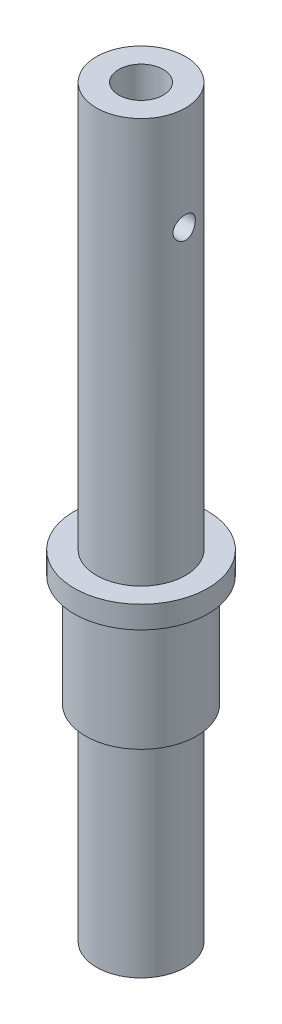
ISO-10303-21;
HEADER;
FILE_DESCRIPTION(('STEP AP214'),'2;1');
FILE_NAME('part.step','',(''),(''),'','','');
FILE_SCHEMA(('AUTOMOTIVE_DESIGN { 1 0 10303 214 1 1 1 1 }'));
ENDSEC;
DATA;
#1=APPLICATION_CONTEXT('core data for automotive mechanical design processes');
#2=APPLICATION_PROTOCOL_DEFINITION('international standard','automotive_design',2000,#1);
#3=PRODUCT_CONTEXT('',#1,'mechanical');
#4=PRODUCT('Part','Part','',(#3));
#5=PRODUCT_RELATED_PRODUCT_CATEGORY('part','',(#4));
#6=PRODUCT_DEFINITION_FORMATION('','',#4);
#7=PRODUCT_DEFINITION_CONTEXT('part definition',#1,'design');
#8=PRODUCT_DEFINITION('design','',#6,#7);
#9=PRODUCT_DEFINITION_SHAPE('','',#8);
#10=(LENGTH_UNIT() NAMED_UNIT(*) SI_UNIT(.MILLI.,.METRE.));
#11=(NAMED_UNIT(*) PLANE_ANGLE_UNIT() SI_UNIT($,.RADIAN.));
#12=(NAMED_UNIT(*) SI_UNIT($,.STERADIAN.) SOLID_ANGLE_UNIT());
#13=UNCERTAINTY_MEASURE_WITH_UNIT(LENGTH_MEASURE(1.E-05),#10,'distance_accuracy_value','');
#14=(GEOMETRIC_REPRESENTATION_CONTEXT(3) GLOBAL_UNCERTAINTY_ASSIGNED_CONTEXT((#13)) GLOBAL_UNIT_ASSIGNED_CONTEXT((#10,
#11,#12)) REPRESENTATION_CONTEXT('',''));
#15=CARTESIAN_POINT('',(0.,0.,0.));
#16=DIRECTION('',(0.,0.,1.));
#17=DIRECTION('',(1.,0.,0.));
#18=AXIS2_PLACEMENT_3D('',#15,#16,#17);
#19=CARTESIAN_POINT('',(0.,10.2921875,0.));
#20=DIRECTION('',(0.,-1.,0.));
#21=DIRECTION('',(0.,0.,-1.));
#22=AXIS2_PLACEMENT_3D('',#19,#20,#21);
#23=CYLINDRICAL_SURFACE('',#22,4.);
#24=CARTESIAN_POINT('',(0.,10.2921875,0.));
#25=DIRECTION('',(0.,1.,0.));
#26=DIRECTION('',(0.,0.,1.));
#27=AXIS2_PLACEMENT_3D('',#24,#25,#26);
#28=CIRCLE('',#27,4.);
#29=CARTESIAN_POINT('',(0.,10.2921875,4.));
#30=VERTEX_POINT('',#29);
#31=EDGE_CURVE('E10',#30,#30,#28,.T.);
#32=ORIENTED_EDGE('',*,*,#31,.F.);
#33=EDGE_LOOP('',(#32));
#34=FACE_BOUND('',#33,.T.);
#35=CARTESIAN_POINT('',(0.,-26.0921875,0.));
#36=DIRECTION('',(0.,-1.,0.));
#37=DIRECTION('',(0.,0.,-1.));
#38=AXIS2_PLACEMENT_3D('',#35,#36,#37);
#39=CIRCLE('',#38,4.);
#40=CARTESIAN_POINT('',(0.,-26.0921875,-4.));
#41=VERTEX_POINT('',#40);
#42=EDGE_CURVE('E81',#41,#41,#39,.T.);
#43=ORIENTED_EDGE('',*,*,#42,.F.);
#44=EDGE_LOOP('',(#43));
#45=FACE_BOUND('',#44,.T.);
#46=CARTESIAN_POINT('',(-3.87298334620742,1.,1.));
#47=CARTESIAN_POINT('',(-3.87298440057185,1.05522030035679,0.999998431438699));
#48=CARTESIAN_POINT('',(-3.87417722499278,1.11045795943136,0.995410498208069));
#49=CARTESIAN_POINT('',(-3.87880744892249,1.21934703123261,0.977209250194446));
#50=CARTESIAN_POINT('',(-3.8822461547418,1.27299750177997,0.963590682698077));
#51=CARTESIAN_POINT('',(-3.89095489813012,1.37712141528784,0.927796479849635));
#52=CARTESIAN_POINT('',(-3.8962225706936,1.42759886215776,0.905631891140943));
#53=CARTESIAN_POINT('',(-3.90799276818327,1.52412434101248,0.853408456505407));
#54=CARTESIAN_POINT('',(-3.91449534553241,1.57017218483115,0.823349275424505));
#55=CARTESIAN_POINT('',(-3.92816286540368,1.65754465810584,0.755483370924517));
#56=CARTESIAN_POINT('',(-3.93533839048709,1.69875744014028,0.717534755081557));
#57=CARTESIAN_POINT('',(-3.94945150206622,1.77430455774388,0.635272825640328));
#58=CARTESIAN_POINT('',(-3.95638906626691,1.80863825024863,0.59095891767214));
#59=CARTESIAN_POINT('',(-3.96936166208095,1.86991018705258,0.496458080431565));
#60=CARTESIAN_POINT('',(-3.975382749602,1.8967385552646,0.446197830478044));
#61=CARTESIAN_POINT('',(-3.9857232477043,1.94152385766121,0.34170527371711));
#62=CARTESIAN_POINT('',(-3.99004290933747,1.9594821007662,0.287473554316778));
#63=CARTESIAN_POINT('',(-3.99641903539262,1.98565913383144,0.177743503501664));
#64=CARTESIAN_POINT('',(-3.99851957537723,1.99406785773063,0.12229308781959));
#65=CARTESIAN_POINT('',(-4.00037437642922,2.00150335171022,0.0107315277051085));
#66=CARTESIAN_POINT('',(-4.00012898438682,2.00053150888384,-0.0453795178152269));
#67=CARTESIAN_POINT('',(-3.99735237981413,1.98937005989994,-0.155352247172387));
#68=CARTESIAN_POINT('',(-3.99487200936349,1.97938546997846,-0.209236215601067));
#69=CARTESIAN_POINT('',(-3.98796334609942,1.9508114919806,-0.314538247413686));
#70=CARTESIAN_POINT('',(-3.98353494959376,1.93222164584904,-0.365956179370438));
#71=CARTESIAN_POINT('',(-3.97315003880358,1.88679897172517,-0.465406703501806));
#72=CARTESIAN_POINT('',(-3.96718007878021,1.8598931821353,-0.513404509766504));
#73=CARTESIAN_POINT('',(-3.9543596152386,1.7986577283535,-0.604275622340488));
#74=CARTESIAN_POINT('',(-3.94750895860996,1.76432677257575,-0.647148035085505));
#75=CARTESIAN_POINT('',(-3.93345485507808,1.68811650320705,-0.727774035084956));
#76=CARTESIAN_POINT('',(-3.92624687810367,1.64605804306089,-0.765357679075199));
#77=CARTESIAN_POINT('',(-3.91246017406683,1.5561600105839,-0.832976375963018));
#78=CARTESIAN_POINT('',(-3.90588147642388,1.5083201682036,-0.863011076046016));
#79=CARTESIAN_POINT('',(-3.89408198732659,1.40788398634041,-0.914788129022597));
#80=CARTESIAN_POINT('',(-3.88886793490288,1.35526570787472,-0.936489566970491));
#81=CARTESIAN_POINT('',(-3.88047456055983,1.24696581276942,-0.97068562063634));
#82=CARTESIAN_POINT('',(-3.87729480324087,1.19128485440675,-0.98318220655291));
#83=CARTESIAN_POINT('',(-3.87342142415656,1.08001619939075,-0.998331855466071));
#84=CARTESIAN_POINT('',(-3.87266435637459,1.02446488266815,-1.00123618956785));
#85=CARTESIAN_POINT('',(-3.87354937392416,0.913671225368737,-0.997806796206219));
#86=CARTESIAN_POINT('',(-3.87519123840506,0.858428856819504,-0.99147391913952));
#87=CARTESIAN_POINT('',(-3.88062832781824,0.750754294018118,-0.969970185575065));
#88=CARTESIAN_POINT('',(-3.8843878809375,0.698290909371663,-0.954945627312698));
#89=CARTESIAN_POINT('',(-3.89360287308385,0.596627416859327,-0.916647232668248));
#90=CARTESIAN_POINT('',(-3.89905851299445,0.547427696377865,-0.893372419085018));
#91=CARTESIAN_POINT('',(-3.91118454837305,0.452623488853061,-0.838708267174623));
#92=CARTESIAN_POINT('',(-3.91787667442657,0.407108463982759,-0.807168701534252));
#93=CARTESIAN_POINT('',(-3.93166833228686,0.321924654879459,-0.737060292934456));
#94=CARTESIAN_POINT('',(-3.93876793091388,0.282256833339971,-0.69849029480544));
#95=CARTESIAN_POINT('',(-3.95278961212643,0.208875582971618,-0.614262720984726));
#96=CARTESIAN_POINT('',(-3.95970280824734,0.175335974980476,-0.568451952531593));
#97=CARTESIAN_POINT('',(-3.97238886645494,0.116425653219503,-0.471702682694676));
#98=CARTESIAN_POINT('',(-3.97816178801584,0.0910545133567177,-0.420764448957592));
#99=CARTESIAN_POINT('',(-3.98788046295326,0.0494215861888277,-0.315558201731091));
#100=CARTESIAN_POINT('',(-3.99183932008964,0.0330942862483756,-0.261317381027882));
#101=CARTESIAN_POINT('',(-3.99754117358315,0.00981586615663329,-0.150749760318808));
#102=CARTESIAN_POINT('',(-3.99928459757363,0.00286293650437964,-0.094423365041244));
#103=CARTESIAN_POINT('',(-4.00034169408811,-0.00136758957553398,0.0170835264433261));
#104=CARTESIAN_POINT('',(-3.99971978880008,0.0010982909046098,0.072253826966033));
#105=CARTESIAN_POINT('',(-3.99625896457423,0.0150478272943316,0.181367496414739));
#106=CARTESIAN_POINT('',(-3.99342011157094,0.0265312150131025,0.235310901780886));
#107=CARTESIAN_POINT('',(-3.98585432853963,0.0580522197709269,0.340171035644816));
#108=CARTESIAN_POINT('',(-3.98113764502669,0.0780434533146239,0.391102494581018));
#109=CARTESIAN_POINT('',(-3.97031288913382,0.125970579019327,0.488917053041467));
#110=CARTESIAN_POINT('',(-3.96420464137727,0.153907472669569,0.53579964126505));
#111=CARTESIAN_POINT('',(-3.95107249681342,0.21771523399707,0.6254019284239));
#112=CARTESIAN_POINT('',(-3.94403016945646,0.253760142907367,0.667994988300587));
#113=CARTESIAN_POINT('',(-3.92990649053207,0.332422851973808,0.746615020271251));
#114=CARTESIAN_POINT('',(-3.92282512952424,0.375042316097944,0.782640325068177));
#115=CARTESIAN_POINT('',(-3.90927475860683,0.466601414201294,0.84776202647924));
#116=CARTESIAN_POINT('',(-3.90281963730391,0.515644123412482,0.876716619446593));
#117=CARTESIAN_POINT('',(-3.8914395555011,0.618055489922846,0.925926896615622));
#118=CARTESIAN_POINT('',(-3.88651348244814,0.671420966107285,0.946188909759556));
#119=CARTESIAN_POINT('',(-3.87951908741315,0.770577011826274,0.974422528565571));
#120=CARTESIAN_POINT('',(-3.87708663005761,0.815893164382358,0.983993170595829));
#121=CARTESIAN_POINT('',(-3.87381838580358,0.907468869001466,0.996782292572819));
#122=CARTESIAN_POINT('',(-3.87298246270639,0.953728340250628,1.00000131437052));
#123=CARTESIAN_POINT('',(-3.87298334620742,1.,1.));
#124=B_SPLINE_CURVE_WITH_KNOTS('',3,(#46,#47,#48,#49,#50,#51,#52,#53,#54,#55,#56,#57,#58,#59,
#60,#61,#62,#63,#64,#65,#66,#67,#68,#69,#70,#71,#72,#73,#74,#75,#76,#77,#78,#79,#80,#81,#82,#83,
#84,#85,#86,#87,#88,#89,#90,#91,#92,#93,#94,#95,#96,#97,#98,#99,#100,#101,#102,#103,#104,#105,
#106,#107,#108,#109,#110,#111,#112,#113,#114,#115,#116,#117,#118,#119,#120,#121,#122,#123),
.UNSPECIFIED.,.T.,.F.,(4,2,2,2,2,2,2,2,2,2,2,2,2,2,2,2,2,2,2,2,2,2,2,2,2,2,2,2,2,2,2,2,2,2,2,2,
2,2,4),(0.,0.16549097667523,0.331078296534211,0.496452290829153,0.661833306984658,
0.830495816734649,0.999174085882211,1.17020598555442,1.34121263935111,1.50875500394413,
1.67627259462683,1.84007305071853,2.00388222686189,2.16917149698052,2.3344895418384,
2.50428186625039,2.67408212476195,2.84470572799635,3.01529280048093,3.18137429900961,
3.34744050869795,3.51078961999957,3.67415808564841,3.84073138339937,4.00733207550292,
4.17810132382402,4.34886166284096,4.51836829119046,4.6878421955989,4.85273378447257,
5.01762046947067,5.18161950620159,5.34563922291503,5.51358838629103,5.68158012622478,
5.85270590910145,6.02370688542922,6.16239130867206,6.30106390036083),.UNSPECIFIED.);
#125=CARTESIAN_POINT('',(-3.87298334620742,1.,1.));
#126=VERTEX_POINT('',#125);
#127=EDGE_CURVE('E50',#126,#126,#124,.T.);
#128=ORIENTED_EDGE('',*,*,#127,.F.);
#129=EDGE_LOOP('',(#128));
#130=FACE_BOUND('',#129,.T.);
#131=CARTESIAN_POINT('',(3.87298334620742,1.,1.));
#132=CARTESIAN_POINT('',(3.87298440057185,0.944779699643215,0.999998431438699));
#133=CARTESIAN_POINT('',(3.87417722499278,0.88954204056864,0.995410498208069));
#134=CARTESIAN_POINT('',(3.87880744892249,0.780652968767387,0.977209250194446));
#135=CARTESIAN_POINT('',(3.8822461547418,0.727002498220035,0.963590682698077));
#136=CARTESIAN_POINT('',(3.89095489813012,0.622878584712162,0.927796479849635));
#137=CARTESIAN_POINT('',(3.8962225706936,0.572401137842241,0.905631891140943));
#138=CARTESIAN_POINT('',(3.90799276818327,0.475875658987524,0.853408456505407));
#139=CARTESIAN_POINT('',(3.91449534553241,0.429827815168853,0.823349275424505));
#140=CARTESIAN_POINT('',(3.92816286540368,0.342455341894155,0.755483370924517));
#141=CARTESIAN_POINT('',(3.93533839048709,0.301242559859724,0.717534755081557));
#142=CARTESIAN_POINT('',(3.94945150206622,0.225695442256121,0.635272825640328));
#143=CARTESIAN_POINT('',(3.95638906626691,0.191361749751371,0.59095891767214));
#144=CARTESIAN_POINT('',(3.96936166208095,0.130089812947419,0.496458080431565));
#145=CARTESIAN_POINT('',(3.975382749602,0.103261444735395,0.446197830478043));
#146=CARTESIAN_POINT('',(3.9857232477043,0.0584761423387856,0.34170527371711));
#147=CARTESIAN_POINT('',(3.99004290933747,0.0405178992337993,0.287473554316777));
#148=CARTESIAN_POINT('',(3.99641903539262,0.0143408661685612,0.177743503501663));
#149=CARTESIAN_POINT('',(3.99851957537723,0.00593214226936615,0.12229308781959));
#150=CARTESIAN_POINT('',(4.00037437642922,-0.00150335171021991,0.0107315277051079));
#151=CARTESIAN_POINT('',(4.00012898438682,-0.00053150888383951,-0.0453795178152274));
#152=CARTESIAN_POINT('',(3.99735237981413,0.0106299401000572,-0.155352247172387));
#153=CARTESIAN_POINT('',(3.99487200936349,0.0206145300215424,-0.209236215601067));
#154=CARTESIAN_POINT('',(3.98796334609942,0.0491885080193998,-0.314538247413686));
#155=CARTESIAN_POINT('',(3.98353494959376,0.0677783541509637,-0.365956179370438));
#156=CARTESIAN_POINT('',(3.97315003880358,0.113201028274826,-0.465406703501807));
#157=CARTESIAN_POINT('',(3.96718007878021,0.140106817864699,-0.513404509766504));
#158=CARTESIAN_POINT('',(3.9543596152386,0.201342271646503,-0.604275622340489));
#159=CARTESIAN_POINT('',(3.94750895860996,0.235673227424248,-0.647148035085505));
#160=CARTESIAN_POINT('',(3.93345485507808,0.31188349679295,-0.727774035084956));
#161=CARTESIAN_POINT('',(3.92624687810367,0.353941956939109,-0.765357679075199));
#162=CARTESIAN_POINT('',(3.91246017406683,0.443839989416101,-0.832976375963018));
#163=CARTESIAN_POINT('',(3.90588147642388,0.4916798317964,-0.863011076046016));
#164=CARTESIAN_POINT('',(3.89408198732659,0.592116013659586,-0.914788129022598));
#165=CARTESIAN_POINT('',(3.88886793490288,0.644734292125278,-0.936489566970491));
#166=CARTESIAN_POINT('',(3.88047456055983,0.753034187230581,-0.970685620636341));
#167=CARTESIAN_POINT('',(3.87729480324087,0.808715145593255,-0.98318220655291));
#168=CARTESIAN_POINT('',(3.87342142415656,0.919983800609248,-0.998331855466071));
#169=CARTESIAN_POINT('',(3.87266435637459,0.975535117331852,-1.00123618956785));
#170=CARTESIAN_POINT('',(3.87354937392416,1.08632877463126,-0.997806796206219));
#171=CARTESIAN_POINT('',(3.87519123840506,1.1415711431805,-0.99147391913952));
#172=CARTESIAN_POINT('',(3.88062832781824,1.24924570598188,-0.969970185575065));
#173=CARTESIAN_POINT('',(3.8843878809375,1.30170909062834,-0.954945627312698));
#174=CARTESIAN_POINT('',(3.89360287308385,1.40337258314067,-0.916647232668248));
#175=CARTESIAN_POINT('',(3.89905851299445,1.45257230362214,-0.893372419085018));
#176=CARTESIAN_POINT('',(3.91118454837305,1.54737651114694,-0.838708267174623));
#177=CARTESIAN_POINT('',(3.91787667442657,1.59289153601724,-0.807168701534251));
#178=CARTESIAN_POINT('',(3.93166833228686,1.67807534512054,-0.737060292934456));
#179=CARTESIAN_POINT('',(3.93876793091388,1.71774316666003,-0.698490294805439));
#180=CARTESIAN_POINT('',(3.95278961212643,1.79112441702838,-0.614262720984726));
#181=CARTESIAN_POINT('',(3.95970280824734,1.82466402501952,-0.568451952531593));
#182=CARTESIAN_POINT('',(3.97238886645494,1.8835743467805,-0.471702682694675));
#183=CARTESIAN_POINT('',(3.97816178801584,1.90894548664328,-0.420764448957591));
#184=CARTESIAN_POINT('',(3.98788046295326,1.95057841381117,-0.31555820173109));
#185=CARTESIAN_POINT('',(3.99183932008964,1.96690571375162,-0.261317381027881));
#186=CARTESIAN_POINT('',(3.99754117358315,1.99018413384337,-0.150749760318808));
#187=CARTESIAN_POINT('',(3.99928459757363,1.99713706349562,-0.0944233650412434));
#188=CARTESIAN_POINT('',(4.00034169408811,2.00136758957553,0.0170835264433266));
#189=CARTESIAN_POINT('',(3.99971978880008,1.99890170909539,0.0722538269660335));
#190=CARTESIAN_POINT('',(3.99625896457423,1.98495217270567,0.18136749641474));
#191=CARTESIAN_POINT('',(3.99342011157094,1.9734687849869,0.235310901780887));
#192=CARTESIAN_POINT('',(3.98585432853963,1.94194778022907,0.340171035644816));
#193=CARTESIAN_POINT('',(3.98113764502669,1.92195654668538,0.391102494581019));
#194=CARTESIAN_POINT('',(3.97031288913382,1.87402942098067,0.488917053041468));
#195=CARTESIAN_POINT('',(3.96420464137727,1.84609252733043,0.535799641265051));
#196=CARTESIAN_POINT('',(3.95107249681342,1.78228476600293,0.6254019284239));
#197=CARTESIAN_POINT('',(3.94403016945647,1.74623985709263,0.667994988300587));
#198=CARTESIAN_POINT('',(3.92990649053207,1.66757714802619,0.746615020271251));
#199=CARTESIAN_POINT('',(3.92282512952424,1.62495768390206,0.782640325068178));
#200=CARTESIAN_POINT('',(3.90927475860683,1.53339858579871,0.84776202647924));
#201=CARTESIAN_POINT('',(3.90281963730391,1.48435587658752,0.876716619446593));
#202=CARTESIAN_POINT('',(3.8914395555011,1.38194451007715,0.925926896615622));
#203=CARTESIAN_POINT('',(3.88651348244814,1.32857903389271,0.946188909759557));
#204=CARTESIAN_POINT('',(3.87951908741315,1.22942298817373,0.974422528565571));
#205=CARTESIAN_POINT('',(3.87708663005761,1.18410683561764,0.983993170595829));
#206=CARTESIAN_POINT('',(3.87381838580358,1.09253113099853,0.996782292572819));
#207=CARTESIAN_POINT('',(3.87298246270639,1.04627165974937,1.00000131437052));
#208=CARTESIAN_POINT('',(3.87298334620742,1.,1.));
#209=B_SPLINE_CURVE_WITH_KNOTS('',3,(#131,#132,#133,#134,#135,#136,#137,#138,#139,#140,#141,
#142,#143,#144,#145,#146,#147,#148,#149,#150,#151,#152,#153,#154,#155,#156,#157,#158,#159,#160,
#161,#162,#163,#164,#165,#166,#167,#168,#169,#170,#171,#172,#173,#174,#175,#176,#177,#178,#179,
#180,#181,#182,#183,#184,#185,#186,#187,#188,#189,#190,#191,#192,#193,#194,#195,#196,#197,#198,
#199,#200,#201,#202,#203,#204,#205,#206,#207,#208),.UNSPECIFIED.,.T.,.F.,(4,2,2,2,2,2,2,2,2,2,2,
2,2,2,2,2,2,2,2,2,2,2,2,2,2,2,2,2,2,2,2,2,2,2,2,2,2,2,4),(0.,0.16549097667523,0.331078296534211,
0.496452290829153,0.661833306984659,0.830495816734649,0.999174085882211,1.17020598555442,
1.34121263935111,1.50875500394413,1.67627259462683,1.84007305071853,2.00388222686189,
2.16917149698052,2.3344895418384,2.50428186625039,2.67408212476195,2.84470572799635,
3.01529280048093,3.18137429900961,3.34744050869795,3.51078961999957,3.67415808564841,
3.84073138339937,4.00733207550292,4.17810132382402,4.34886166284096,4.51836829119046,
4.6878421955989,4.85273378447257,5.01762046947067,5.18161950620159,5.34563922291503,
5.51358838629103,5.68158012622478,5.85270590910145,6.02370688542922,6.16239130867206,
6.30106390036083),.UNSPECIFIED.);
#210=CARTESIAN_POINT('',(3.87298334620742,1.,1.));
#211=VERTEX_POINT('',#210);
#212=EDGE_CURVE('E35',#211,#211,#209,.T.);
#213=ORIENTED_EDGE('',*,*,#212,.F.);
#214=EDGE_LOOP('',(#213));
#215=FACE_BOUND('',#214,.T.);
#216=ADVANCED_FACE('F31',(#34,#45,#130,#215),#23,.T.);
#217=CARTESIAN_POINT('',(0.,10.2921875,0.));
#218=DIRECTION('',(0.,1.,0.));
#219=DIRECTION('',(0.,0.,1.));
#220=AXIS2_PLACEMENT_3D('',#217,#218,#219);
#221=PLANE('',#220);
#222=CARTESIAN_POINT('',(0.,10.2921875,0.));
#223=DIRECTION('',(0.,1.,0.));
#224=DIRECTION('',(0.,0.,1.));
#225=AXIS2_PLACEMENT_3D('',#222,#223,#224);
#226=CIRCLE('',#225,2.);
#227=CARTESIAN_POINT('',(0.,10.2921875,2.));
#228=VERTEX_POINT('',#227);
#229=EDGE_CURVE('E47',#228,#228,#226,.T.);
#230=ORIENTED_EDGE('',*,*,#229,.F.);
#231=EDGE_LOOP('',(#230));
#232=FACE_BOUND('',#231,.T.);
#233=ORIENTED_EDGE('',*,*,#31,.T.);
#234=EDGE_LOOP('',(#233));
#235=FACE_BOUND('',#234,.T.);
#236=ADVANCED_FACE('F70',(#232,#235),#221,.T.);
#237=CARTESIAN_POINT('',(0.,4.,0.));
#238=DIRECTION('',(0.,1.,0.));
#239=DIRECTION('',(0.,0.,1.));
#240=AXIS2_PLACEMENT_3D('',#237,#238,#239);
#241=CYLINDRICAL_SURFACE('',#240,2.);
#242=CARTESIAN_POINT('',(0.,4.,0.));
#243=DIRECTION('',(0.,1.,0.));
#244=DIRECTION('',(0.,0.,1.));
#245=AXIS2_PLACEMENT_3D('',#242,#243,#244);
#246=CIRCLE('',#245,2.);
#247=CARTESIAN_POINT('',(0.,4.,2.));
#248=VERTEX_POINT('',#247);
#249=EDGE_CURVE('E42',#248,#248,#246,.T.);
#250=ORIENTED_EDGE('',*,*,#249,.F.);
#251=EDGE_LOOP('',(#250));
#252=FACE_BOUND('',#251,.T.);
#253=ORIENTED_EDGE('',*,*,#229,.T.);
#254=EDGE_LOOP('',(#253));
#255=FACE_BOUND('',#254,.T.);
#256=ADVANCED_FACE('F67',(#252,#255),#241,.F.);
#257=CARTESIAN_POINT('',(0.,4.,0.));
#258=DIRECTION('',(0.,1.,0.));
#259=DIRECTION('',(0.,0.,1.));
#260=AXIS2_PLACEMENT_3D('',#257,#258,#259);
#261=PLANE('',#260);
#262=ORIENTED_EDGE('',*,*,#249,.T.);
#263=EDGE_LOOP('',(#262));
#264=FACE_BOUND('',#263,.T.);
#265=ADVANCED_FACE('F61',(#264),#261,.T.);
#266=CARTESIAN_POINT('',(10.,1.,0.));
#267=DIRECTION('',(-1.,0.,0.));
#268=DIRECTION('',(0.,0.,1.));
#269=AXIS2_PLACEMENT_3D('',#266,#267,#268);
#270=CYLINDRICAL_SURFACE('',#269,1.);
#271=ORIENTED_EDGE('',*,*,#127,.T.);
#272=EDGE_LOOP('',(#271));
#273=FACE_BOUND('',#272,.T.);
#274=ORIENTED_EDGE('',*,*,#212,.T.);
#275=EDGE_LOOP('',(#274));
#276=FACE_BOUND('',#275,.T.);
#277=ADVANCED_FACE('F55',(#273,#276),#270,.F.);
#278=CARTESIAN_POINT('',(0.,-28.0921875,0.));
#279=DIRECTION('',(0.,1.,0.));
#280=DIRECTION('',(0.,0.,1.));
#281=AXIS2_PLACEMENT_3D('',#278,#279,#280);
#282=CYLINDRICAL_SURFACE('',#281,6.);
#283=CARTESIAN_POINT('',(0.,-28.0921875,0.));
#284=DIRECTION('',(0.,-1.,0.));
#285=DIRECTION('',(0.,0.,-1.));
#286=AXIS2_PLACEMENT_3D('',#283,#284,#285);
#287=CIRCLE('',#286,6.);
#288=CARTESIAN_POINT('',(0.,-28.0921875,-6.));
#289=VERTEX_POINT('',#288);
#290=EDGE_CURVE('E54',#289,#289,#287,.T.);
#291=ORIENTED_EDGE('',*,*,#290,.F.);
#292=EDGE_LOOP('',(#291));
#293=FACE_BOUND('',#292,.T.);
#294=CARTESIAN_POINT('',(0.,-26.0921875,0.));
#295=DIRECTION('',(0.,-1.,0.));
#296=DIRECTION('',(0.,0.,-1.));
#297=AXIS2_PLACEMENT_3D('',#294,#295,#296);
#298=CIRCLE('',#297,6.);
#299=CARTESIAN_POINT('',(0.,-26.0921875,-6.));
#300=VERTEX_POINT('',#299);
#301=EDGE_CURVE('E88',#300,#300,#298,.T.);
#302=ORIENTED_EDGE('',*,*,#301,.T.);
#303=EDGE_LOOP('',(#302));
#304=FACE_BOUND('',#303,.T.);
#305=ADVANCED_FACE('F60',(#293,#304),#282,.T.);
#306=CARTESIAN_POINT('',(0.,-28.0921875,0.));
#307=DIRECTION('',(0.,-1.,0.));
#308=DIRECTION('',(0.,0.,-1.));
#309=AXIS2_PLACEMENT_3D('',#306,#307,#308);
#310=PLANE('',#309);
#311=CARTESIAN_POINT('',(0.,-28.0921875,0.));
#312=DIRECTION('',(0.,-1.,0.));
#313=DIRECTION('',(0.,0.,-1.));
#314=AXIS2_PLACEMENT_3D('',#311,#312,#313);
#315=CIRCLE('',#314,5.);
#316=CARTESIAN_POINT('',(0.,-28.0921875,-5.));
#317=VERTEX_POINT('',#316);
#318=EDGE_CURVE('E94',#317,#317,#315,.T.);
#319=ORIENTED_EDGE('',*,*,#318,.F.);
#320=EDGE_LOOP('',(#319));
#321=FACE_BOUND('',#320,.T.);
#322=ORIENTED_EDGE('',*,*,#290,.T.);
#323=EDGE_LOOP('',(#322));
#324=FACE_BOUND('',#323,.T.);
#325=ADVANCED_FACE('F127',(#321,#324),#310,.T.);
#326=CARTESIAN_POINT('',(0.,-26.0921875,0.));
#327=DIRECTION('',(0.,-1.,0.));
#328=DIRECTION('',(0.,0.,-1.));
#329=AXIS2_PLACEMENT_3D('',#326,#327,#328);
#330=PLANE('',#329);
#331=ORIENTED_EDGE('',*,*,#42,.T.);
#332=EDGE_LOOP('',(#331));
#333=FACE_BOUND('',#332,.T.);
#334=ORIENTED_EDGE('',*,*,#301,.F.);
#335=EDGE_LOOP('',(#334));
#336=FACE_BOUND('',#335,.T.);
#337=ADVANCED_FACE('F123',(#333,#336),#330,.F.);
#338=CARTESIAN_POINT('',(0.,-38.0921875,0.));
#339=DIRECTION('',(0.,1.,0.));
#340=DIRECTION('',(0.,0.,1.));
#341=AXIS2_PLACEMENT_3D('',#338,#339,#340);
#342=CYLINDRICAL_SURFACE('',#341,5.);
#343=CARTESIAN_POINT('',(0.,-38.0921875,0.));
#344=DIRECTION('',(0.,-1.,0.));
#345=DIRECTION('',(0.,0.,-1.));
#346=AXIS2_PLACEMENT_3D('',#343,#344,#345);
#347=CIRCLE('',#346,5.);
#348=CARTESIAN_POINT('',(0.,-38.0921875,-5.));
#349=VERTEX_POINT('',#348);
#350=EDGE_CURVE('E91',#349,#349,#347,.T.);
#351=ORIENTED_EDGE('',*,*,#350,.F.);
#352=EDGE_LOOP('',(#351));
#353=FACE_BOUND('',#352,.T.);
#354=ORIENTED_EDGE('',*,*,#318,.T.);
#355=EDGE_LOOP('',(#354));
#356=FACE_BOUND('',#355,.T.);
#357=ADVANCED_FACE('F117',(#353,#356),#342,.T.);
#358=CARTESIAN_POINT('',(0.,-38.0921875,0.));
#359=DIRECTION('',(0.,-1.,0.));
#360=DIRECTION('',(0.,0.,-1.));
#361=AXIS2_PLACEMENT_3D('',#358,#359,#360);
#362=PLANE('',#361);
#363=CARTESIAN_POINT('',(0.,-38.0921875,0.));
#364=DIRECTION('',(0.,-1.,0.));
#365=DIRECTION('',(0.,0.,-1.));
#366=AXIS2_PLACEMENT_3D('',#363,#364,#365);
#367=CIRCLE('',#366,4.);
#368=CARTESIAN_POINT('',(0.,-38.0921875,-4.));
#369=VERTEX_POINT('',#368);
#370=EDGE_CURVE('E100',#369,#369,#367,.T.);
#371=ORIENTED_EDGE('',*,*,#370,.F.);
#372=EDGE_LOOP('',(#371));
#373=FACE_BOUND('',#372,.T.);
#374=ORIENTED_EDGE('',*,*,#350,.T.);
#375=EDGE_LOOP('',(#374));
#376=FACE_BOUND('',#375,.T.);
#377=ADVANCED_FACE('F111',(#373,#376),#362,.T.);
#378=CARTESIAN_POINT('',(0.,-56.5921875,0.));
#379=DIRECTION('',(0.,1.,0.));
#380=DIRECTION('',(0.,0.,1.));
#381=AXIS2_PLACEMENT_3D('',#378,#379,#380);
#382=CYLINDRICAL_SURFACE('',#381,4.);
#383=CARTESIAN_POINT('',(0.,-56.5921875,0.));
#384=DIRECTION('',(0.,-1.,0.));
#385=DIRECTION('',(0.,0.,-1.));
#386=AXIS2_PLACEMENT_3D('',#383,#384,#385);
#387=CIRCLE('',#386,4.);
#388=CARTESIAN_POINT('',(0.,-56.5921875,-4.));
#389=VERTEX_POINT('',#388);
#390=EDGE_CURVE('E97',#389,#389,#387,.T.);
#391=ORIENTED_EDGE('',*,*,#390,.F.);
#392=EDGE_LOOP('',(#391));
#393=FACE_BOUND('',#392,.T.);
#394=ORIENTED_EDGE('',*,*,#370,.T.);
#395=EDGE_LOOP('',(#394));
#396=FACE_BOUND('',#395,.T.);
#397=ADVANCED_FACE('F108',(#393,#396),#382,.T.);
#398=CARTESIAN_POINT('',(0.,-56.5921875,0.));
#399=DIRECTION('',(0.,-1.,0.));
#400=DIRECTION('',(0.,0.,-1.));
#401=AXIS2_PLACEMENT_3D('',#398,#399,#400);
#402=PLANE('',#401);
#403=ORIENTED_EDGE('',*,*,#390,.T.);
#404=EDGE_LOOP('',(#403));
#405=FACE_BOUND('',#404,.T.);
#406=ADVANCED_FACE('F106',(#405),#402,.T.);
#407=CLOSED_SHELL('',(#216,#236,#256,#265,#277,#305,#325,#337,#357,#377,#397,#406));
#408=MANIFOLD_SOLID_BREP('B2',#407);
#409=ADVANCED_BREP_SHAPE_REPRESENTATION('',(#18,#408),#14);
#410=SHAPE_DEFINITION_REPRESENTATION(#9,#409);
ENDSEC;
END-ISO-10303-21;
